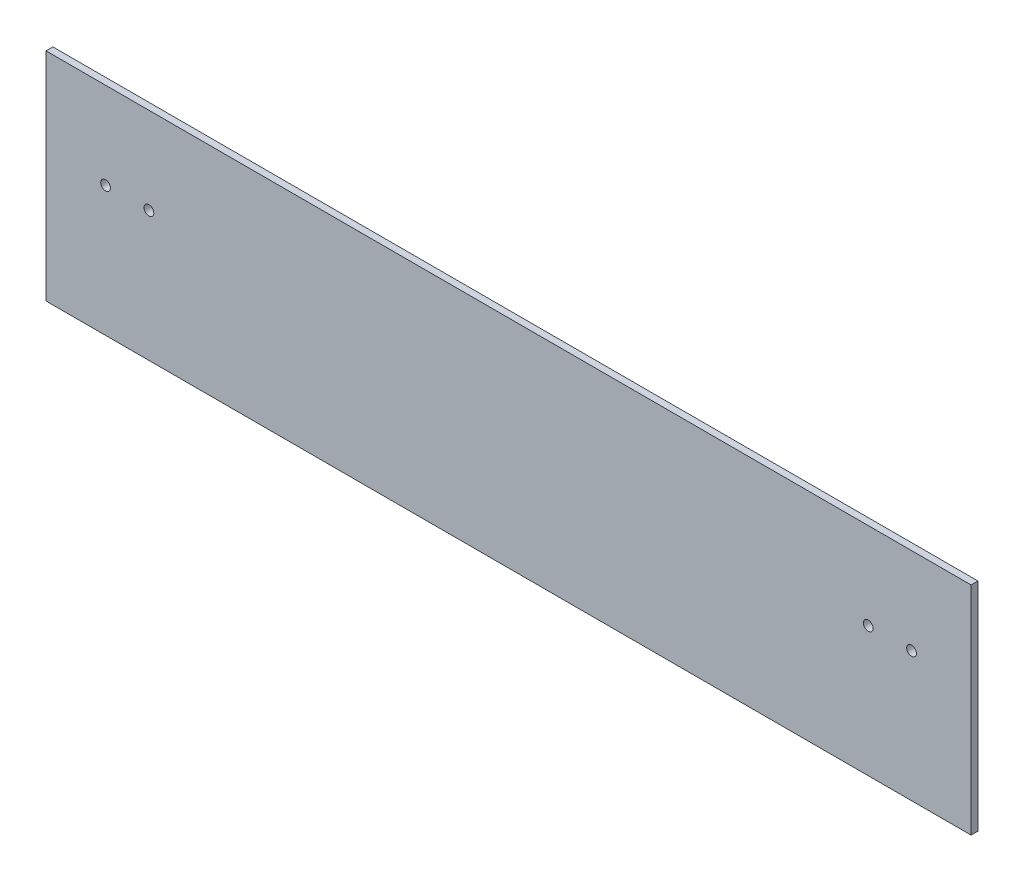
ISO-10303-21;
HEADER;
FILE_DESCRIPTION(('STEP AP214'),'2;1');
FILE_NAME('part.step','',(''),(''),'','','');
FILE_SCHEMA(('AUTOMOTIVE_DESIGN { 1 0 10303 214 1 1 1 1 }'));
ENDSEC;
DATA;
#1=APPLICATION_CONTEXT('core data for automotive mechanical design processes');
#2=APPLICATION_PROTOCOL_DEFINITION('international standard','automotive_design',2000,#1);
#3=PRODUCT_CONTEXT('',#1,'mechanical');
#4=PRODUCT('Part','Part','',(#3));
#5=PRODUCT_RELATED_PRODUCT_CATEGORY('part','',(#4));
#6=PRODUCT_DEFINITION_FORMATION('','',#4);
#7=PRODUCT_DEFINITION_CONTEXT('part definition',#1,'design');
#8=PRODUCT_DEFINITION('design','',#6,#7);
#9=PRODUCT_DEFINITION_SHAPE('','',#8);
#10=(LENGTH_UNIT() NAMED_UNIT(*) SI_UNIT(.MILLI.,.METRE.));
#11=(NAMED_UNIT(*) PLANE_ANGLE_UNIT() SI_UNIT($,.RADIAN.));
#12=(NAMED_UNIT(*) SI_UNIT($,.STERADIAN.) SOLID_ANGLE_UNIT());
#13=UNCERTAINTY_MEASURE_WITH_UNIT(LENGTH_MEASURE(1.E-05),#10,'distance_accuracy_value','');
#14=(GEOMETRIC_REPRESENTATION_CONTEXT(3) GLOBAL_UNCERTAINTY_ASSIGNED_CONTEXT((#13)) GLOBAL_UNIT_ASSIGNED_CONTEXT((#10,
#11,#12)) REPRESENTATION_CONTEXT('',''));
#15=CARTESIAN_POINT('',(0.,0.,0.));
#16=DIRECTION('',(0.,0.,1.));
#17=DIRECTION('',(1.,0.,0.));
#18=AXIS2_PLACEMENT_3D('',#15,#16,#17);
#19=CARTESIAN_POINT('',(0.,0.,3.175));
#20=DIRECTION('',(1.,0.,0.));
#21=DIRECTION('',(0.,0.,-1.));
#22=AXIS2_PLACEMENT_3D('',#19,#20,#21);
#23=PLANE('',#22);
#24=DIRECTION('',(0.,-1.,0.));
#25=VECTOR('',#24,1.);
#26=CARTESIAN_POINT('',(0.,0.,0.));
#27=LINE('',#26,#25);
#28=CARTESIAN_POINT('',(0.,100.,0.));
#29=VERTEX_POINT('',#28);
#30=CARTESIAN_POINT('',(0.,0.,0.));
#31=VERTEX_POINT('',#30);
#32=EDGE_CURVE('E98',#29,#31,#27,.T.);
#33=ORIENTED_EDGE('',*,*,#32,.T.);
#34=DIRECTION('',(0.,0.,-1.));
#35=VECTOR('',#34,1.);
#36=CARTESIAN_POINT('',(0.,0.,3.175));
#37=LINE('',#36,#35);
#38=CARTESIAN_POINT('',(0.,0.,3.175));
#39=VERTEX_POINT('',#38);
#40=EDGE_CURVE('E11',#39,#31,#37,.T.);
#41=ORIENTED_EDGE('',*,*,#40,.F.);
#42=DIRECTION('',(0.,-1.,0.));
#43=VECTOR('',#42,1.);
#44=CARTESIAN_POINT('',(0.,0.,3.175));
#45=LINE('',#44,#43);
#46=CARTESIAN_POINT('',(0.,100.,3.175));
#47=VERTEX_POINT('',#46);
#48=EDGE_CURVE('E86',#47,#39,#45,.T.);
#49=ORIENTED_EDGE('',*,*,#48,.F.);
#50=DIRECTION('',(0.,0.,-1.));
#51=VECTOR('',#50,1.);
#52=CARTESIAN_POINT('',(0.,100.,3.175));
#53=LINE('',#52,#51);
#54=EDGE_CURVE('E94',#47,#29,#53,.T.);
#55=ORIENTED_EDGE('',*,*,#54,.T.);
#56=EDGE_LOOP('',(#33,#41,#49,#55));
#57=FACE_BOUND('',#56,.T.);
#58=ADVANCED_FACE('F35',(#57),#23,.F.);
#59=CARTESIAN_POINT('',(0.,0.,3.175));
#60=DIRECTION('',(0.,1.,0.));
#61=DIRECTION('',(0.,0.,1.));
#62=AXIS2_PLACEMENT_3D('',#59,#60,#61);
#63=PLANE('',#62);
#64=DIRECTION('',(1.,0.,0.));
#65=VECTOR('',#64,1.);
#66=CARTESIAN_POINT('',(0.,0.,0.));
#67=LINE('',#66,#65);
#68=CARTESIAN_POINT('',(427.,0.,0.));
#69=VERTEX_POINT('',#68);
#70=EDGE_CURVE('E90',#31,#69,#67,.T.);
#71=ORIENTED_EDGE('',*,*,#70,.T.);
#72=DIRECTION('',(0.,0.,-1.));
#73=VECTOR('',#72,1.);
#74=CARTESIAN_POINT('',(427.,0.,3.175));
#75=LINE('',#74,#73);
#76=CARTESIAN_POINT('',(427.,0.,3.175));
#77=VERTEX_POINT('',#76);
#78=EDGE_CURVE('E43',#77,#69,#75,.T.);
#79=ORIENTED_EDGE('',*,*,#78,.F.);
#80=DIRECTION('',(1.,0.,0.));
#81=VECTOR('',#80,1.);
#82=CARTESIAN_POINT('',(0.,0.,3.175));
#83=LINE('',#82,#81);
#84=EDGE_CURVE('E81',#39,#77,#83,.T.);
#85=ORIENTED_EDGE('',*,*,#84,.F.);
#86=ORIENTED_EDGE('',*,*,#40,.T.);
#87=EDGE_LOOP('',(#71,#79,#85,#86));
#88=FACE_BOUND('',#87,.T.);
#89=ADVANCED_FACE('F89',(#88),#63,.F.);
#90=CARTESIAN_POINT('',(427.,0.,3.175));
#91=DIRECTION('',(-1.,0.,0.));
#92=DIRECTION('',(0.,0.,1.));
#93=AXIS2_PLACEMENT_3D('',#90,#91,#92);
#94=PLANE('',#93);
#95=DIRECTION('',(0.,1.,0.));
#96=VECTOR('',#95,1.);
#97=CARTESIAN_POINT('',(427.,0.,0.));
#98=LINE('',#97,#96);
#99=CARTESIAN_POINT('',(427.,100.,0.));
#100=VERTEX_POINT('',#99);
#101=EDGE_CURVE('E68',#69,#100,#98,.T.);
#102=ORIENTED_EDGE('',*,*,#101,.T.);
#103=DIRECTION('',(0.,0.,-1.));
#104=VECTOR('',#103,1.);
#105=CARTESIAN_POINT('',(427.,100.,3.175));
#106=LINE('',#105,#104);
#107=CARTESIAN_POINT('',(427.,100.,3.175));
#108=VERTEX_POINT('',#107);
#109=EDGE_CURVE('E91',#108,#100,#106,.T.);
#110=ORIENTED_EDGE('',*,*,#109,.F.);
#111=DIRECTION('',(0.,1.,0.));
#112=VECTOR('',#111,1.);
#113=CARTESIAN_POINT('',(427.,0.,3.175));
#114=LINE('',#113,#112);
#115=EDGE_CURVE('E84',#77,#108,#114,.T.);
#116=ORIENTED_EDGE('',*,*,#115,.F.);
#117=ORIENTED_EDGE('',*,*,#78,.T.);
#118=EDGE_LOOP('',(#102,#110,#116,#117));
#119=FACE_BOUND('',#118,.T.);
#120=ADVANCED_FACE('F92',(#119),#94,.F.);
#121=CARTESIAN_POINT('',(0.,100.,3.175));
#122=DIRECTION('',(0.,-1.,0.));
#123=DIRECTION('',(0.,0.,-1.));
#124=AXIS2_PLACEMENT_3D('',#121,#122,#123);
#125=PLANE('',#124);
#126=DIRECTION('',(-1.,0.,0.));
#127=VECTOR('',#126,1.);
#128=CARTESIAN_POINT('',(0.,100.,0.));
#129=LINE('',#128,#127);
#130=EDGE_CURVE('E74',#100,#29,#129,.T.);
#131=ORIENTED_EDGE('',*,*,#130,.T.);
#132=ORIENTED_EDGE('',*,*,#54,.F.);
#133=DIRECTION('',(-1.,0.,0.));
#134=VECTOR('',#133,1.);
#135=CARTESIAN_POINT('',(0.,100.,3.175));
#136=LINE('',#135,#134);
#137=EDGE_CURVE('E51',#108,#47,#136,.T.);
#138=ORIENTED_EDGE('',*,*,#137,.F.);
#139=ORIENTED_EDGE('',*,*,#109,.T.);
#140=EDGE_LOOP('',(#131,#132,#138,#139));
#141=FACE_BOUND('',#140,.T.);
#142=ADVANCED_FACE('F106',(#141),#125,.F.);
#143=CARTESIAN_POINT('',(0.,0.,3.175));
#144=DIRECTION('',(0.,0.,-1.));
#145=DIRECTION('',(-1.,0.,0.));
#146=AXIS2_PLACEMENT_3D('',#143,#144,#145);
#147=PLANE('',#146);
#148=CARTESIAN_POINT('',(399.5,60.0000000000002,3.175));
#149=DIRECTION('',(0.,0.,-1.));
#150=DIRECTION('',(-1.,0.,0.));
#151=AXIS2_PLACEMENT_3D('',#148,#149,#150);
#152=CIRCLE('',#151,2.24999999999995);
#153=CARTESIAN_POINT('',(397.25,60.0000000000002,3.175));
#154=VERTEX_POINT('',#153);
#155=EDGE_CURVE('E101',#154,#154,#152,.T.);
#156=ORIENTED_EDGE('',*,*,#155,.T.);
#157=EDGE_LOOP('',(#156));
#158=FACE_BOUND('',#157,.T.);
#159=CARTESIAN_POINT('',(47.4999999999999,60.0000000000002,3.175));
#160=DIRECTION('',(0.,0.,-1.));
#161=DIRECTION('',(1.,0.,0.));
#162=AXIS2_PLACEMENT_3D('',#159,#160,#161);
#163=CIRCLE('',#162,2.24999999999995);
#164=CARTESIAN_POINT('',(49.7499999999999,60.0000000000002,3.175));
#165=VERTEX_POINT('',#164);
#166=EDGE_CURVE('E116',#165,#165,#163,.T.);
#167=ORIENTED_EDGE('',*,*,#166,.T.);
#168=EDGE_LOOP('',(#167));
#169=FACE_BOUND('',#168,.T.);
#170=CARTESIAN_POINT('',(27.4999999999999,60.0000000000002,3.175));
#171=DIRECTION('',(0.,0.,-1.));
#172=DIRECTION('',(1.,0.,0.));
#173=AXIS2_PLACEMENT_3D('',#170,#171,#172);
#174=CIRCLE('',#173,2.24999999999995);
#175=CARTESIAN_POINT('',(29.7499999999999,60.0000000000002,3.175));
#176=VERTEX_POINT('',#175);
#177=EDGE_CURVE('E115',#176,#176,#174,.T.);
#178=ORIENTED_EDGE('',*,*,#177,.T.);
#179=EDGE_LOOP('',(#178));
#180=FACE_BOUND('',#179,.T.);
#181=CARTESIAN_POINT('',(379.5,60.0000000000002,3.175));
#182=DIRECTION('',(0.,0.,-1.));
#183=DIRECTION('',(-1.,0.,0.));
#184=AXIS2_PLACEMENT_3D('',#181,#182,#183);
#185=CIRCLE('',#184,2.24999999999995);
#186=CARTESIAN_POINT('',(377.25,60.0000000000002,3.175));
#187=VERTEX_POINT('',#186);
#188=EDGE_CURVE('E122',#187,#187,#185,.T.);
#189=ORIENTED_EDGE('',*,*,#188,.T.);
#190=EDGE_LOOP('',(#189));
#191=FACE_BOUND('',#190,.T.);
#192=ORIENTED_EDGE('',*,*,#48,.T.);
#193=ORIENTED_EDGE('',*,*,#84,.T.);
#194=ORIENTED_EDGE('',*,*,#115,.T.);
#195=ORIENTED_EDGE('',*,*,#137,.T.);
#196=EDGE_LOOP('',(#192,#193,#194,#195));
#197=FACE_BOUND('',#196,.T.);
#198=ADVANCED_FACE('F82',(#158,#169,#180,#191,#197),#147,.F.);
#199=CARTESIAN_POINT('',(0.,0.,0.));
#200=DIRECTION('',(0.,0.,-1.));
#201=DIRECTION('',(-1.,0.,0.));
#202=AXIS2_PLACEMENT_3D('',#199,#200,#201);
#203=PLANE('',#202);
#204=CARTESIAN_POINT('',(399.5,60.0000000000002,0.));
#205=DIRECTION('',(0.,0.,-1.));
#206=DIRECTION('',(-1.,0.,0.));
#207=AXIS2_PLACEMENT_3D('',#204,#205,#206);
#208=CIRCLE('',#207,2.24999999999995);
#209=CARTESIAN_POINT('',(397.25,60.0000000000002,0.));
#210=VERTEX_POINT('',#209);
#211=EDGE_CURVE('E125',#210,#210,#208,.T.);
#212=ORIENTED_EDGE('',*,*,#211,.F.);
#213=EDGE_LOOP('',(#212));
#214=FACE_BOUND('',#213,.T.);
#215=CARTESIAN_POINT('',(47.4999999999999,60.0000000000002,0.));
#216=DIRECTION('',(0.,0.,-1.));
#217=DIRECTION('',(1.,0.,0.));
#218=AXIS2_PLACEMENT_3D('',#215,#216,#217);
#219=CIRCLE('',#218,2.24999999999995);
#220=CARTESIAN_POINT('',(49.7499999999999,60.0000000000002,0.));
#221=VERTEX_POINT('',#220);
#222=EDGE_CURVE('E126',#221,#221,#219,.T.);
#223=ORIENTED_EDGE('',*,*,#222,.F.);
#224=EDGE_LOOP('',(#223));
#225=FACE_BOUND('',#224,.T.);
#226=CARTESIAN_POINT('',(27.4999999999999,60.0000000000002,0.));
#227=DIRECTION('',(0.,0.,-1.));
#228=DIRECTION('',(1.,0.,0.));
#229=AXIS2_PLACEMENT_3D('',#226,#227,#228);
#230=CIRCLE('',#229,2.24999999999995);
#231=CARTESIAN_POINT('',(29.7499999999999,60.0000000000002,0.));
#232=VERTEX_POINT('',#231);
#233=EDGE_CURVE('E112',#232,#232,#230,.T.);
#234=ORIENTED_EDGE('',*,*,#233,.F.);
#235=EDGE_LOOP('',(#234));
#236=FACE_BOUND('',#235,.T.);
#237=CARTESIAN_POINT('',(379.5,60.0000000000002,0.));
#238=DIRECTION('',(0.,0.,-1.));
#239=DIRECTION('',(-1.,0.,0.));
#240=AXIS2_PLACEMENT_3D('',#237,#238,#239);
#241=CIRCLE('',#240,2.24999999999995);
#242=CARTESIAN_POINT('',(377.25,60.0000000000002,0.));
#243=VERTEX_POINT('',#242);
#244=EDGE_CURVE('E119',#243,#243,#241,.T.);
#245=ORIENTED_EDGE('',*,*,#244,.F.);
#246=EDGE_LOOP('',(#245));
#247=FACE_BOUND('',#246,.T.);
#248=ORIENTED_EDGE('',*,*,#32,.F.);
#249=ORIENTED_EDGE('',*,*,#130,.F.);
#250=ORIENTED_EDGE('',*,*,#101,.F.);
#251=ORIENTED_EDGE('',*,*,#70,.F.);
#252=EDGE_LOOP('',(#248,#249,#250,#251));
#253=FACE_BOUND('',#252,.T.);
#254=ADVANCED_FACE('F109',(#214,#225,#236,#247,#253),#203,.T.);
#255=CARTESIAN_POINT('',(379.5,60.0000000000002,3.175));
#256=DIRECTION('',(0.,0.,-1.));
#257=DIRECTION('',(-1.,0.,0.));
#258=AXIS2_PLACEMENT_3D('',#255,#256,#257);
#259=CYLINDRICAL_SURFACE('',#258,2.24999999999995);
#260=ORIENTED_EDGE('',*,*,#188,.F.);
#261=EDGE_LOOP('',(#260));
#262=FACE_BOUND('',#261,.T.);
#263=ORIENTED_EDGE('',*,*,#244,.T.);
#264=EDGE_LOOP('',(#263));
#265=FACE_BOUND('',#264,.T.);
#266=ADVANCED_FACE('F147',(#262,#265),#259,.F.);
#267=CARTESIAN_POINT('',(27.4999999999999,60.0000000000002,3.175));
#268=DIRECTION('',(0.,0.,-1.));
#269=DIRECTION('',(-1.,0.,0.));
#270=AXIS2_PLACEMENT_3D('',#267,#268,#269);
#271=CYLINDRICAL_SURFACE('',#270,2.24999999999995);
#272=ORIENTED_EDGE('',*,*,#177,.F.);
#273=EDGE_LOOP('',(#272));
#274=FACE_BOUND('',#273,.T.);
#275=ORIENTED_EDGE('',*,*,#233,.T.);
#276=EDGE_LOOP('',(#275));
#277=FACE_BOUND('',#276,.T.);
#278=ADVANCED_FACE('F156',(#274,#277),#271,.F.);
#279=CARTESIAN_POINT('',(47.4999999999999,60.0000000000002,3.175));
#280=DIRECTION('',(0.,0.,-1.));
#281=DIRECTION('',(-1.,0.,0.));
#282=AXIS2_PLACEMENT_3D('',#279,#280,#281);
#283=CYLINDRICAL_SURFACE('',#282,2.24999999999995);
#284=ORIENTED_EDGE('',*,*,#166,.F.);
#285=EDGE_LOOP('',(#284));
#286=FACE_BOUND('',#285,.T.);
#287=ORIENTED_EDGE('',*,*,#222,.T.);
#288=EDGE_LOOP('',(#287));
#289=FACE_BOUND('',#288,.T.);
#290=ADVANCED_FACE('F141',(#286,#289),#283,.F.);
#291=CARTESIAN_POINT('',(399.5,60.0000000000002,3.175));
#292=DIRECTION('',(0.,0.,-1.));
#293=DIRECTION('',(-1.,0.,0.));
#294=AXIS2_PLACEMENT_3D('',#291,#292,#293);
#295=CYLINDRICAL_SURFACE('',#294,2.24999999999995);
#296=ORIENTED_EDGE('',*,*,#155,.F.);
#297=EDGE_LOOP('',(#296));
#298=FACE_BOUND('',#297,.T.);
#299=ORIENTED_EDGE('',*,*,#211,.T.);
#300=EDGE_LOOP('',(#299));
#301=FACE_BOUND('',#300,.T.);
#302=ADVANCED_FACE('F138',(#298,#301),#295,.F.);
#303=CLOSED_SHELL('',(#58,#89,#120,#142,#198,#254,#266,#278,#290,#302));
#304=MANIFOLD_SOLID_BREP('B2',#303);
#305=ADVANCED_BREP_SHAPE_REPRESENTATION('',(#18,#304),#14);
#306=SHAPE_DEFINITION_REPRESENTATION(#9,#305);
ENDSEC;
END-ISO-10303-21;
